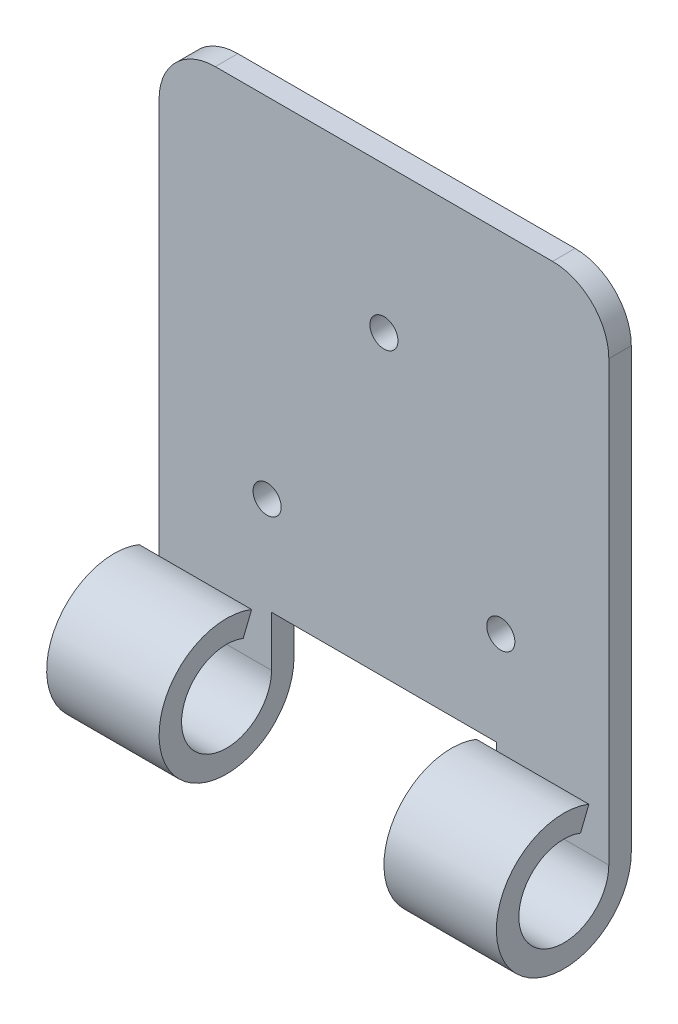
ISO-10303-21;
HEADER;
FILE_DESCRIPTION(('STEP AP214'),'2;1');
FILE_NAME('part.step','',(''),(''),'','','');
FILE_SCHEMA(('AUTOMOTIVE_DESIGN { 1 0 10303 214 1 1 1 1 }'));
ENDSEC;
DATA;
#1=APPLICATION_CONTEXT('core data for automotive mechanical design processes');
#2=APPLICATION_PROTOCOL_DEFINITION('international standard','automotive_design',2000,#1);
#3=PRODUCT_CONTEXT('',#1,'mechanical');
#4=PRODUCT('Part','Part','',(#3));
#5=PRODUCT_RELATED_PRODUCT_CATEGORY('part','',(#4));
#6=PRODUCT_DEFINITION_FORMATION('','',#4);
#7=PRODUCT_DEFINITION_CONTEXT('part definition',#1,'design');
#8=PRODUCT_DEFINITION('design','',#6,#7);
#9=PRODUCT_DEFINITION_SHAPE('','',#8);
#10=(LENGTH_UNIT() NAMED_UNIT(*) SI_UNIT(.MILLI.,.METRE.));
#11=(NAMED_UNIT(*) PLANE_ANGLE_UNIT() SI_UNIT($,.RADIAN.));
#12=(NAMED_UNIT(*) SI_UNIT($,.STERADIAN.) SOLID_ANGLE_UNIT());
#13=UNCERTAINTY_MEASURE_WITH_UNIT(LENGTH_MEASURE(1.E-05),#10,'distance_accuracy_value','');
#14=(GEOMETRIC_REPRESENTATION_CONTEXT(3) GLOBAL_UNCERTAINTY_ASSIGNED_CONTEXT((#13)) GLOBAL_UNIT_ASSIGNED_CONTEXT((#10,
#11,#12)) REPRESENTATION_CONTEXT('',''));
#15=CARTESIAN_POINT('',(0.,0.,0.));
#16=DIRECTION('',(0.,0.,1.));
#17=DIRECTION('',(1.,0.,0.));
#18=AXIS2_PLACEMENT_3D('',#15,#16,#17);
#19=CARTESIAN_POINT('',(0.,0.,2.));
#20=DIRECTION('',(1.,0.,0.));
#21=DIRECTION('',(0.,0.,-1.));
#22=AXIS2_PLACEMENT_3D('',#19,#20,#21);
#23=PLANE('',#22);
#24=DIRECTION('',(0.,-1.,0.));
#25=VECTOR('',#24,1.);
#26=CARTESIAN_POINT('',(0.,0.,0.));
#27=LINE('',#26,#25);
#28=CARTESIAN_POINT('',(0.,45.,0.));
#29=VERTEX_POINT('',#28);
#30=CARTESIAN_POINT('',(0.,6.,0.));
#31=VERTEX_POINT('',#30);
#32=EDGE_CURVE('E232',#29,#31,#27,.T.);
#33=ORIENTED_EDGE('',*,*,#32,.T.);
#34=CARTESIAN_POINT('',(0.,6.,6.));
#35=DIRECTION('',(-1.,0.,0.));
#36=DIRECTION('',(0.,0.,1.));
#37=AXIS2_PLACEMENT_3D('',#34,#35,#36);
#38=CIRCLE('',#37,6.);
#39=CARTESIAN_POINT('',(0.,11.5712381917052,3.77260129045439));
#40=VERTEX_POINT('',#39);
#41=EDGE_CURVE('E187',#31,#40,#38,.T.);
#42=ORIENTED_EDGE('',*,*,#41,.T.);
#43=DIRECTION('',(0.,-0.928539698617532,0.371233118257601));
#44=VECTOR('',#43,1.);
#45=CARTESIAN_POINT('',(0.,11.5712381917052,3.77260129045439));
#46=LINE('',#45,#44);
#47=CARTESIAN_POINT('',(0.,9.71415879447013,4.51506752696959));
#48=VERTEX_POINT('',#47);
#49=EDGE_CURVE('E199',#40,#48,#46,.T.);
#50=ORIENTED_EDGE('',*,*,#49,.T.);
#51=CARTESIAN_POINT('',(0.,6.,6.));
#52=DIRECTION('',(-1.,0.,0.));
#53=DIRECTION('',(0.,0.,1.));
#54=AXIS2_PLACEMENT_3D('',#51,#52,#53);
#55=CIRCLE('',#54,4.);
#56=CARTESIAN_POINT('',(0.,6.,2.));
#57=VERTEX_POINT('',#56);
#58=EDGE_CURVE('E191',#57,#48,#55,.T.);
#59=ORIENTED_EDGE('',*,*,#58,.F.);
#60=DIRECTION('',(0.,-1.,0.));
#61=VECTOR('',#60,1.);
#62=CARTESIAN_POINT('',(0.,0.,2.));
#63=LINE('',#62,#61);
#64=CARTESIAN_POINT('',(0.,45.,2.));
#65=VERTEX_POINT('',#64);
#66=EDGE_CURVE('E222',#65,#57,#63,.T.);
#67=ORIENTED_EDGE('',*,*,#66,.F.);
#68=DIRECTION('',(0.,0.,-1.));
#69=VECTOR('',#68,1.);
#70=CARTESIAN_POINT('',(0.,45.,2.));
#71=LINE('',#70,#69);
#72=EDGE_CURVE('E256',#65,#29,#71,.T.);
#73=ORIENTED_EDGE('',*,*,#72,.T.);
#74=EDGE_LOOP('',(#33,#42,#50,#59,#67,#73));
#75=FACE_BOUND('',#74,.T.);
#76=ADVANCED_FACE('F37',(#75),#23,.F.);
#77=CARTESIAN_POINT('',(40.,0.,2.));
#78=DIRECTION('',(-1.,0.,0.));
#79=DIRECTION('',(0.,0.,1.));
#80=AXIS2_PLACEMENT_3D('',#77,#78,#79);
#81=PLANE('',#80);
#82=DIRECTION('',(0.,1.,0.));
#83=VECTOR('',#82,1.);
#84=CARTESIAN_POINT('',(40.,0.,2.));
#85=LINE('',#84,#83);
#86=CARTESIAN_POINT('',(40.,6.,2.));
#87=VERTEX_POINT('',#86);
#88=CARTESIAN_POINT('',(40.,45.,2.));
#89=VERTEX_POINT('',#88);
#90=EDGE_CURVE('E225',#87,#89,#85,.T.);
#91=ORIENTED_EDGE('',*,*,#90,.F.);
#92=CARTESIAN_POINT('',(40.,6.,6.));
#93=DIRECTION('',(1.,0.,0.));
#94=DIRECTION('',(0.,0.,1.));
#95=AXIS2_PLACEMENT_3D('',#92,#93,#94);
#96=CIRCLE('',#95,4.);
#97=CARTESIAN_POINT('',(40.,9.71415879447013,4.51506752696959));
#98=VERTEX_POINT('',#97);
#99=EDGE_CURVE('E171',#98,#87,#96,.T.);
#100=ORIENTED_EDGE('',*,*,#99,.F.);
#101=DIRECTION('',(0.,-0.928539698617533,0.3712331182576));
#102=VECTOR('',#101,1.);
#103=CARTESIAN_POINT('',(40.,11.5712381917052,3.77260129045439));
#104=LINE('',#103,#102);
#105=CARTESIAN_POINT('',(40.,11.5712381917052,3.77260129045439));
#106=VERTEX_POINT('',#105);
#107=EDGE_CURVE('E176',#106,#98,#104,.T.);
#108=ORIENTED_EDGE('',*,*,#107,.F.);
#109=CARTESIAN_POINT('',(40.,6.,6.));
#110=DIRECTION('',(-1.,0.,0.));
#111=DIRECTION('',(0.,0.,1.));
#112=AXIS2_PLACEMENT_3D('',#109,#110,#111);
#113=CIRCLE('',#112,6.);
#114=CARTESIAN_POINT('',(40.,6.,0.));
#115=VERTEX_POINT('',#114);
#116=EDGE_CURVE('E167',#115,#106,#113,.T.);
#117=ORIENTED_EDGE('',*,*,#116,.F.);
#118=DIRECTION('',(0.,1.,0.));
#119=VECTOR('',#118,1.);
#120=CARTESIAN_POINT('',(40.,0.,0.));
#121=LINE('',#120,#119);
#122=CARTESIAN_POINT('',(40.,45.,0.));
#123=VERTEX_POINT('',#122);
#124=EDGE_CURVE('E235',#115,#123,#121,.T.);
#125=ORIENTED_EDGE('',*,*,#124,.T.);
#126=DIRECTION('',(0.,0.,-1.));
#127=VECTOR('',#126,1.);
#128=CARTESIAN_POINT('',(40.,45.,2.));
#129=LINE('',#128,#127);
#130=EDGE_CURVE('E249',#123,#89,#129,.F.);
#131=ORIENTED_EDGE('',*,*,#130,.T.);
#132=EDGE_LOOP('',(#91,#100,#108,#117,#125,#131));
#133=FACE_BOUND('',#132,.T.);
#134=ADVANCED_FACE('F297',(#133),#81,.F.);
#135=CARTESIAN_POINT('',(0.,0.,2.));
#136=DIRECTION('',(0.,0.,-1.));
#137=DIRECTION('',(-1.,0.,0.));
#138=AXIS2_PLACEMENT_3D('',#135,#136,#137);
#139=PLANE('',#138);
#140=CARTESIAN_POINT('',(20.,37.,2.));
#141=DIRECTION('',(0.,0.,1.));
#142=DIRECTION('',(1.,0.,0.));
#143=AXIS2_PLACEMENT_3D('',#140,#141,#142);
#144=CIRCLE('',#143,1.25);
#145=CARTESIAN_POINT('',(21.25,37.,2.));
#146=VERTEX_POINT('',#145);
#147=EDGE_CURVE('E212',#146,#146,#144,.T.);
#148=ORIENTED_EDGE('',*,*,#147,.F.);
#149=EDGE_LOOP('',(#148));
#150=FACE_BOUND('',#149,.T.);
#151=CARTESIAN_POINT('',(9.60769515458718,18.9999999999998,2.));
#152=DIRECTION('',(0.,0.,1.));
#153=DIRECTION('',(1.,0.,0.));
#154=AXIS2_PLACEMENT_3D('',#151,#152,#153);
#155=CIRCLE('',#154,1.25);
#156=CARTESIAN_POINT('',(10.8576951545872,18.9999999999998,2.));
#157=VERTEX_POINT('',#156);
#158=EDGE_CURVE('E217',#157,#157,#155,.T.);
#159=ORIENTED_EDGE('',*,*,#158,.F.);
#160=EDGE_LOOP('',(#159));
#161=FACE_BOUND('',#160,.T.);
#162=CARTESIAN_POINT('',(30.3923048454137,19.0000000000002,2.));
#163=DIRECTION('',(0.,0.,1.));
#164=DIRECTION('',(1.,0.,0.));
#165=AXIS2_PLACEMENT_3D('',#162,#163,#164);
#166=CIRCLE('',#165,1.25);
#167=CARTESIAN_POINT('',(31.6423048454137,19.0000000000002,2.));
#168=VERTEX_POINT('',#167);
#169=EDGE_CURVE('E213',#168,#168,#166,.T.);
#170=ORIENTED_EDGE('',*,*,#169,.F.);
#171=EDGE_LOOP('',(#170));
#172=FACE_BOUND('',#171,.T.);
#173=DIRECTION('',(-1.,0.,0.));
#174=VECTOR('',#173,1.);
#175=CARTESIAN_POINT('',(30.,10.4721359549996,2.));
#176=LINE('',#175,#174);
#177=CARTESIAN_POINT('',(30.,10.4721359549996,2.));
#178=VERTEX_POINT('',#177);
#179=CARTESIAN_POINT('',(10.,10.4721359549996,2.));
#180=VERTEX_POINT('',#179);
#181=EDGE_CURVE('E146',#178,#180,#176,.T.);
#182=ORIENTED_EDGE('',*,*,#181,.F.);
#183=DIRECTION('',(0.,-1.,0.));
#184=VECTOR('',#183,1.);
#185=CARTESIAN_POINT('',(30.,0.,2.));
#186=LINE('',#185,#184);
#187=CARTESIAN_POINT('',(30.,6.,2.));
#188=VERTEX_POINT('',#187);
#189=EDGE_CURVE('E152',#178,#188,#186,.T.);
#190=ORIENTED_EDGE('',*,*,#189,.T.);
#191=DIRECTION('',(1.,0.,0.));
#192=VECTOR('',#191,1.);
#193=CARTESIAN_POINT('',(30.,6.,2.));
#194=LINE('',#193,#192);
#195=EDGE_CURVE('E174',#188,#87,#194,.T.);
#196=ORIENTED_EDGE('',*,*,#195,.T.);
#197=ORIENTED_EDGE('',*,*,#90,.T.);
#198=CARTESIAN_POINT('',(35.,45.,2.));
#199=DIRECTION('',(0.,0.,-1.));
#200=DIRECTION('',(-1.,0.,0.));
#201=AXIS2_PLACEMENT_3D('',#198,#199,#200);
#202=CIRCLE('',#201,5.);
#203=CARTESIAN_POINT('',(35.,50.,2.));
#204=VERTEX_POINT('',#203);
#205=EDGE_CURVE('E254',#89,#204,#202,.F.);
#206=ORIENTED_EDGE('',*,*,#205,.T.);
#207=DIRECTION('',(-1.,0.,0.));
#208=VECTOR('',#207,1.);
#209=CARTESIAN_POINT('',(0.,50.,2.));
#210=LINE('',#209,#208);
#211=CARTESIAN_POINT('',(5.,50.,2.));
#212=VERTEX_POINT('',#211);
#213=EDGE_CURVE('E228',#204,#212,#210,.T.);
#214=ORIENTED_EDGE('',*,*,#213,.T.);
#215=CARTESIAN_POINT('',(5.,45.,2.));
#216=DIRECTION('',(0.,0.,-1.));
#217=DIRECTION('',(-1.,0.,0.));
#218=AXIS2_PLACEMENT_3D('',#215,#216,#217);
#219=CIRCLE('',#218,5.);
#220=EDGE_CURVE('E252',#212,#65,#219,.F.);
#221=ORIENTED_EDGE('',*,*,#220,.T.);
#222=ORIENTED_EDGE('',*,*,#66,.T.);
#223=DIRECTION('',(1.,0.,0.));
#224=VECTOR('',#223,1.);
#225=CARTESIAN_POINT('',(0.,6.,2.));
#226=LINE('',#225,#224);
#227=CARTESIAN_POINT('',(10.,6.,2.));
#228=VERTEX_POINT('',#227);
#229=EDGE_CURVE('E206',#57,#228,#226,.T.);
#230=ORIENTED_EDGE('',*,*,#229,.T.);
#231=DIRECTION('',(0.,-1.,0.));
#232=VECTOR('',#231,1.);
#233=CARTESIAN_POINT('',(10.,0.,2.));
#234=LINE('',#233,#232);
#235=EDGE_CURVE('E159',#180,#228,#234,.T.);
#236=ORIENTED_EDGE('',*,*,#235,.F.);
#237=EDGE_LOOP('',(#182,#190,#196,#197,#206,#214,#221,#222,#230,#236));
#238=FACE_BOUND('',#237,.T.);
#239=ADVANCED_FACE('F161',(#150,#161,#172,#238),#139,.F.);
#240=CARTESIAN_POINT('',(0.,0.,0.));
#241=DIRECTION('',(0.,0.,-1.));
#242=DIRECTION('',(-1.,0.,0.));
#243=AXIS2_PLACEMENT_3D('',#240,#241,#242);
#244=PLANE('',#243);
#245=CARTESIAN_POINT('',(30.3923048454137,19.0000000000002,0.));
#246=DIRECTION('',(0.,0.,-1.));
#247=DIRECTION('',(-1.,0.,0.));
#248=AXIS2_PLACEMENT_3D('',#245,#246,#247);
#249=CIRCLE('',#248,1.25);
#250=CARTESIAN_POINT('',(29.1423048454137,19.0000000000002,0.));
#251=VERTEX_POINT('',#250);
#252=EDGE_CURVE('E236',#251,#251,#249,.T.);
#253=ORIENTED_EDGE('',*,*,#252,.F.);
#254=EDGE_LOOP('',(#253));
#255=FACE_BOUND('',#254,.T.);
#256=CARTESIAN_POINT('',(9.60769515458718,18.9999999999998,0.));
#257=DIRECTION('',(0.,0.,-1.));
#258=DIRECTION('',(-1.,0.,0.));
#259=AXIS2_PLACEMENT_3D('',#256,#257,#258);
#260=CIRCLE('',#259,1.25);
#261=CARTESIAN_POINT('',(8.35769515458718,18.9999999999998,0.));
#262=VERTEX_POINT('',#261);
#263=EDGE_CURVE('E262',#262,#262,#260,.T.);
#264=ORIENTED_EDGE('',*,*,#263,.F.);
#265=EDGE_LOOP('',(#264));
#266=FACE_BOUND('',#265,.T.);
#267=CARTESIAN_POINT('',(20.,37.,0.));
#268=DIRECTION('',(0.,0.,-1.));
#269=DIRECTION('',(-1.,0.,0.));
#270=AXIS2_PLACEMENT_3D('',#267,#268,#269);
#271=CIRCLE('',#270,1.25);
#272=CARTESIAN_POINT('',(18.75,37.,0.));
#273=VERTEX_POINT('',#272);
#274=EDGE_CURVE('E216',#273,#273,#271,.T.);
#275=ORIENTED_EDGE('',*,*,#274,.F.);
#276=EDGE_LOOP('',(#275));
#277=FACE_BOUND('',#276,.T.);
#278=DIRECTION('',(-1.,0.,0.));
#279=VECTOR('',#278,1.);
#280=CARTESIAN_POINT('',(0.,11.1380930314661,0.));
#281=LINE('',#280,#279);
#282=CARTESIAN_POINT('',(30.,11.1380930314661,0.));
#283=VERTEX_POINT('',#282);
#284=CARTESIAN_POINT('',(10.,11.1380930314661,0.));
#285=VERTEX_POINT('',#284);
#286=EDGE_CURVE('E269',#283,#285,#281,.T.);
#287=ORIENTED_EDGE('',*,*,#286,.T.);
#288=DIRECTION('',(0.,-1.,0.));
#289=VECTOR('',#288,1.);
#290=CARTESIAN_POINT('',(10.,6.,0.));
#291=LINE('',#290,#289);
#292=CARTESIAN_POINT('',(10.,6.,0.));
#293=VERTEX_POINT('',#292);
#294=EDGE_CURVE('E272',#285,#293,#291,.T.);
#295=ORIENTED_EDGE('',*,*,#294,.T.);
#296=DIRECTION('',(-1.,0.,0.));
#297=VECTOR('',#296,1.);
#298=CARTESIAN_POINT('',(10.,6.,0.));
#299=LINE('',#298,#297);
#300=EDGE_CURVE('E203',#293,#31,#299,.T.);
#301=ORIENTED_EDGE('',*,*,#300,.T.);
#302=ORIENTED_EDGE('',*,*,#32,.F.);
#303=CARTESIAN_POINT('',(5.,45.,0.));
#304=DIRECTION('',(0.,0.,-1.));
#305=DIRECTION('',(-1.,0.,0.));
#306=AXIS2_PLACEMENT_3D('',#303,#304,#305);
#307=CIRCLE('',#306,5.);
#308=CARTESIAN_POINT('',(5.,50.,0.));
#309=VERTEX_POINT('',#308);
#310=EDGE_CURVE('E244',#29,#309,#307,.T.);
#311=ORIENTED_EDGE('',*,*,#310,.T.);
#312=DIRECTION('',(-1.,0.,0.));
#313=VECTOR('',#312,1.);
#314=CARTESIAN_POINT('',(0.,50.,0.));
#315=LINE('',#314,#313);
#316=CARTESIAN_POINT('',(35.,50.,0.));
#317=VERTEX_POINT('',#316);
#318=EDGE_CURVE('E226',#317,#309,#315,.T.);
#319=ORIENTED_EDGE('',*,*,#318,.F.);
#320=CARTESIAN_POINT('',(35.,45.,0.));
#321=DIRECTION('',(0.,0.,-1.));
#322=DIRECTION('',(-1.,0.,0.));
#323=AXIS2_PLACEMENT_3D('',#320,#321,#322);
#324=CIRCLE('',#323,5.);
#325=EDGE_CURVE('E246',#317,#123,#324,.T.);
#326=ORIENTED_EDGE('',*,*,#325,.T.);
#327=ORIENTED_EDGE('',*,*,#124,.F.);
#328=DIRECTION('',(-1.,0.,0.));
#329=VECTOR('',#328,1.);
#330=CARTESIAN_POINT('',(0.,6.,0.));
#331=LINE('',#330,#329);
#332=CARTESIAN_POINT('',(30.,6.,0.));
#333=VERTEX_POINT('',#332);
#334=EDGE_CURVE('E259',#115,#333,#331,.T.);
#335=ORIENTED_EDGE('',*,*,#334,.T.);
#336=DIRECTION('',(0.,1.,0.));
#337=VECTOR('',#336,1.);
#338=CARTESIAN_POINT('',(30.,0.,0.));
#339=LINE('',#338,#337);
#340=EDGE_CURVE('E51',#333,#283,#339,.T.);
#341=ORIENTED_EDGE('',*,*,#340,.T.);
#342=EDGE_LOOP('',(#287,#295,#301,#302,#311,#319,#326,#327,#335,#341));
#343=FACE_BOUND('',#342,.T.);
#344=ADVANCED_FACE('F281',(#255,#266,#277,#343),#244,.T.);
#345=CARTESIAN_POINT('',(0.,50.,2.));
#346=DIRECTION('',(0.,-1.,0.));
#347=DIRECTION('',(0.,0.,-1.));
#348=AXIS2_PLACEMENT_3D('',#345,#346,#347);
#349=PLANE('',#348);
#350=ORIENTED_EDGE('',*,*,#213,.F.);
#351=DIRECTION('',(0.,0.,-1.));
#352=VECTOR('',#351,1.);
#353=CARTESIAN_POINT('',(35.,50.,2.));
#354=LINE('',#353,#352);
#355=EDGE_CURVE('E241',#204,#317,#354,.T.);
#356=ORIENTED_EDGE('',*,*,#355,.T.);
#357=ORIENTED_EDGE('',*,*,#318,.T.);
#358=DIRECTION('',(0.,0.,-1.));
#359=VECTOR('',#358,1.);
#360=CARTESIAN_POINT('',(5.,50.,2.));
#361=LINE('',#360,#359);
#362=EDGE_CURVE('E231',#309,#212,#361,.F.);
#363=ORIENTED_EDGE('',*,*,#362,.T.);
#364=EDGE_LOOP('',(#350,#356,#357,#363));
#365=FACE_BOUND('',#364,.T.);
#366=ADVANCED_FACE('F306',(#365),#349,.F.);
#367=CARTESIAN_POINT('',(35.,45.,2.));
#368=DIRECTION('',(0.,0.,-1.));
#369=DIRECTION('',(-1.,0.,0.));
#370=AXIS2_PLACEMENT_3D('',#367,#368,#369);
#371=CYLINDRICAL_SURFACE('',#370,5.);
#372=ORIENTED_EDGE('',*,*,#205,.F.);
#373=ORIENTED_EDGE('',*,*,#130,.F.);
#374=ORIENTED_EDGE('',*,*,#325,.F.);
#375=ORIENTED_EDGE('',*,*,#355,.F.);
#376=EDGE_LOOP('',(#372,#373,#374,#375));
#377=FACE_BOUND('',#376,.T.);
#378=ADVANCED_FACE('F302',(#377),#371,.T.);
#379=CARTESIAN_POINT('',(5.,45.,2.));
#380=DIRECTION('',(0.,0.,-1.));
#381=DIRECTION('',(-1.,0.,0.));
#382=AXIS2_PLACEMENT_3D('',#379,#380,#381);
#383=CYLINDRICAL_SURFACE('',#382,5.);
#384=ORIENTED_EDGE('',*,*,#220,.F.);
#385=ORIENTED_EDGE('',*,*,#362,.F.);
#386=ORIENTED_EDGE('',*,*,#310,.F.);
#387=ORIENTED_EDGE('',*,*,#72,.F.);
#388=EDGE_LOOP('',(#384,#385,#386,#387));
#389=FACE_BOUND('',#388,.T.);
#390=ADVANCED_FACE('F310',(#389),#383,.T.);
#391=CARTESIAN_POINT('',(20.,37.,-1.));
#392=DIRECTION('',(0.,0.,1.));
#393=DIRECTION('',(1.,0.,0.));
#394=AXIS2_PLACEMENT_3D('',#391,#392,#393);
#395=CYLINDRICAL_SURFACE('',#394,1.25);
#396=ORIENTED_EDGE('',*,*,#274,.T.);
#397=EDGE_LOOP('',(#396));
#398=FACE_BOUND('',#397,.T.);
#399=ORIENTED_EDGE('',*,*,#147,.T.);
#400=EDGE_LOOP('',(#399));
#401=FACE_BOUND('',#400,.T.);
#402=ADVANCED_FACE('F347',(#398,#401),#395,.F.);
#403=CARTESIAN_POINT('',(9.60769515458718,18.9999999999998,-1.));
#404=DIRECTION('',(0.,0.,1.));
#405=DIRECTION('',(1.,0.,0.));
#406=AXIS2_PLACEMENT_3D('',#403,#404,#405);
#407=CYLINDRICAL_SURFACE('',#406,1.25);
#408=ORIENTED_EDGE('',*,*,#263,.T.);
#409=EDGE_LOOP('',(#408));
#410=FACE_BOUND('',#409,.T.);
#411=ORIENTED_EDGE('',*,*,#158,.T.);
#412=EDGE_LOOP('',(#411));
#413=FACE_BOUND('',#412,.T.);
#414=ADVANCED_FACE('F351',(#410,#413),#407,.F.);
#415=CARTESIAN_POINT('',(30.3923048454137,19.0000000000002,-1.));
#416=DIRECTION('',(0.,0.,1.));
#417=DIRECTION('',(1.,0.,0.));
#418=AXIS2_PLACEMENT_3D('',#415,#416,#417);
#419=CYLINDRICAL_SURFACE('',#418,1.25);
#420=ORIENTED_EDGE('',*,*,#252,.T.);
#421=EDGE_LOOP('',(#420));
#422=FACE_BOUND('',#421,.T.);
#423=ORIENTED_EDGE('',*,*,#169,.T.);
#424=EDGE_LOOP('',(#423));
#425=FACE_BOUND('',#424,.T.);
#426=ADVANCED_FACE('F357',(#422,#425),#419,.F.);
#427=CARTESIAN_POINT('',(10.,6.,6.));
#428=DIRECTION('',(-1.,0.,0.));
#429=DIRECTION('',(0.,0.,1.));
#430=AXIS2_PLACEMENT_3D('',#427,#428,#429);
#431=CYLINDRICAL_SURFACE('',#430,4.);
#432=ORIENTED_EDGE('',*,*,#58,.T.);
#433=DIRECTION('',(-1.,0.,0.));
#434=VECTOR('',#433,1.);
#435=CARTESIAN_POINT('',(10.,9.71415879447013,4.51506752696959));
#436=LINE('',#435,#434);
#437=CARTESIAN_POINT('',(10.,9.71415879447013,4.51506752696959));
#438=VERTEX_POINT('',#437);
#439=EDGE_CURVE('E207',#438,#48,#436,.T.);
#440=ORIENTED_EDGE('',*,*,#439,.F.);
#441=CARTESIAN_POINT('',(10.,6.,6.));
#442=DIRECTION('',(-1.,0.,0.));
#443=DIRECTION('',(0.,0.,1.));
#444=AXIS2_PLACEMENT_3D('',#441,#442,#443);
#445=CIRCLE('',#444,4.);
#446=EDGE_CURVE('E194',#228,#438,#445,.T.);
#447=ORIENTED_EDGE('',*,*,#446,.F.);
#448=ORIENTED_EDGE('',*,*,#229,.F.);
#449=EDGE_LOOP('',(#432,#440,#447,#448));
#450=FACE_BOUND('',#449,.T.);
#451=ADVANCED_FACE('F320',(#450),#431,.F.);
#452=CARTESIAN_POINT('',(10.,11.5712381917052,3.77260129045439));
#453=DIRECTION('',(0.,-0.371233118257601,-0.928539698617532));
#454=DIRECTION('',(0.,0.928539698617532,-0.371233118257601));
#455=AXIS2_PLACEMENT_3D('',#452,#453,#454);
#456=PLANE('',#455);
#457=ORIENTED_EDGE('',*,*,#49,.F.);
#458=DIRECTION('',(-1.,0.,0.));
#459=VECTOR('',#458,1.);
#460=CARTESIAN_POINT('',(10.,11.5712381917052,3.77260129045439));
#461=LINE('',#460,#459);
#462=CARTESIAN_POINT('',(10.,11.5712381917052,3.77260129045439));
#463=VERTEX_POINT('',#462);
#464=EDGE_CURVE('E196',#463,#40,#461,.T.);
#465=ORIENTED_EDGE('',*,*,#464,.F.);
#466=DIRECTION('',(0.,-0.928539698617532,0.371233118257601));
#467=VECTOR('',#466,1.);
#468=CARTESIAN_POINT('',(10.,11.5712381917052,3.77260129045439));
#469=LINE('',#468,#467);
#470=EDGE_CURVE('E190',#463,#438,#469,.T.);
#471=ORIENTED_EDGE('',*,*,#470,.T.);
#472=ORIENTED_EDGE('',*,*,#439,.T.);
#473=EDGE_LOOP('',(#457,#465,#471,#472));
#474=FACE_BOUND('',#473,.T.);
#475=ADVANCED_FACE('F324',(#474),#456,.T.);
#476=CARTESIAN_POINT('',(10.,6.,6.));
#477=DIRECTION('',(-1.,0.,0.));
#478=DIRECTION('',(0.,0.,1.));
#479=AXIS2_PLACEMENT_3D('',#476,#477,#478);
#480=CYLINDRICAL_SURFACE('',#479,6.);
#481=ORIENTED_EDGE('',*,*,#41,.F.);
#482=ORIENTED_EDGE('',*,*,#300,.F.);
#483=CARTESIAN_POINT('',(10.,6.,6.));
#484=DIRECTION('',(-1.,0.,0.));
#485=DIRECTION('',(0.,0.,1.));
#486=AXIS2_PLACEMENT_3D('',#483,#484,#485);
#487=CIRCLE('',#486,6.);
#488=EDGE_CURVE('E188',#293,#463,#487,.T.);
#489=ORIENTED_EDGE('',*,*,#488,.T.);
#490=ORIENTED_EDGE('',*,*,#464,.T.);
#491=EDGE_LOOP('',(#481,#482,#489,#490));
#492=FACE_BOUND('',#491,.T.);
#493=ADVANCED_FACE('F326',(#492),#480,.T.);
#494=CARTESIAN_POINT('',(10.,6.,6.));
#495=DIRECTION('',(-1.,0.,0.));
#496=DIRECTION('',(0.,0.,1.));
#497=AXIS2_PLACEMENT_3D('',#494,#495,#496);
#498=PLANE('',#497);
#499=ORIENTED_EDGE('',*,*,#488,.F.);
#500=ORIENTED_EDGE('',*,*,#294,.F.);
#501=CARTESIAN_POINT('',(10.,11.1380930314661,1.1));
#502=DIRECTION('',(-1.,0.,0.));
#503=DIRECTION('',(0.,0.,1.));
#504=AXIS2_PLACEMENT_3D('',#501,#502,#503);
#505=CIRCLE('',#504,1.1);
#506=CARTESIAN_POINT('',(10.,10.3420504491262,1.85915492957747));
#507=VERTEX_POINT('',#506);
#508=EDGE_CURVE('E45',#285,#507,#505,.T.);
#509=ORIENTED_EDGE('',*,*,#508,.T.);
#510=CARTESIAN_POINT('',(10.,6.,6.));
#511=DIRECTION('',(1.,0.,0.));
#512=DIRECTION('',(0.,0.,-1.));
#513=AXIS2_PLACEMENT_3D('',#510,#511,#512);
#514=CIRCLE('',#513,6.);
#515=EDGE_CURVE('E149',#507,#180,#514,.T.);
#516=ORIENTED_EDGE('',*,*,#515,.T.);
#517=ORIENTED_EDGE('',*,*,#235,.T.);
#518=ORIENTED_EDGE('',*,*,#446,.T.);
#519=ORIENTED_EDGE('',*,*,#470,.F.);
#520=EDGE_LOOP('',(#499,#500,#509,#516,#517,#518,#519));
#521=FACE_BOUND('',#520,.T.);
#522=ADVANCED_FACE('F277',(#521),#498,.F.);
#523=CARTESIAN_POINT('',(30.,6.,6.));
#524=DIRECTION('',(1.,0.,0.));
#525=DIRECTION('',(0.,0.,-1.));
#526=AXIS2_PLACEMENT_3D('',#523,#524,#525);
#527=CYLINDRICAL_SURFACE('',#526,6.);
#528=ORIENTED_EDGE('',*,*,#116,.T.);
#529=DIRECTION('',(1.,0.,0.));
#530=VECTOR('',#529,1.);
#531=CARTESIAN_POINT('',(30.,11.5712381917052,3.77260129045439));
#532=LINE('',#531,#530);
#533=CARTESIAN_POINT('',(30.,11.5712381917052,3.77260129045439));
#534=VERTEX_POINT('',#533);
#535=EDGE_CURVE('E184',#534,#106,#532,.T.);
#536=ORIENTED_EDGE('',*,*,#535,.F.);
#537=CARTESIAN_POINT('',(30.,6.,6.));
#538=DIRECTION('',(-1.,0.,0.));
#539=DIRECTION('',(0.,0.,1.));
#540=AXIS2_PLACEMENT_3D('',#537,#538,#539);
#541=CIRCLE('',#540,6.);
#542=EDGE_CURVE('E168',#333,#534,#541,.T.);
#543=ORIENTED_EDGE('',*,*,#542,.F.);
#544=ORIENTED_EDGE('',*,*,#334,.F.);
#545=EDGE_LOOP('',(#528,#536,#543,#544));
#546=FACE_BOUND('',#545,.T.);
#547=ADVANCED_FACE('F287',(#546),#527,.T.);
#548=CARTESIAN_POINT('',(30.,11.5712381917052,3.77260129045439));
#549=DIRECTION('',(0.,0.3712331182576,0.928539698617533));
#550=DIRECTION('',(0.,-0.928539698617533,0.3712331182576));
#551=AXIS2_PLACEMENT_3D('',#548,#549,#550);
#552=PLANE('',#551);
#553=ORIENTED_EDGE('',*,*,#107,.T.);
#554=DIRECTION('',(1.,0.,0.));
#555=VECTOR('',#554,1.);
#556=CARTESIAN_POINT('',(30.,9.71415879447013,4.51506752696959));
#557=LINE('',#556,#555);
#558=CARTESIAN_POINT('',(30.,9.71415879447013,4.51506752696959));
#559=VERTEX_POINT('',#558);
#560=EDGE_CURVE('E181',#559,#98,#557,.T.);
#561=ORIENTED_EDGE('',*,*,#560,.F.);
#562=DIRECTION('',(0.,-0.928539698617533,0.3712331182576));
#563=VECTOR('',#562,1.);
#564=CARTESIAN_POINT('',(30.,11.5712381917052,3.77260129045439));
#565=LINE('',#564,#563);
#566=EDGE_CURVE('E170',#534,#559,#565,.T.);
#567=ORIENTED_EDGE('',*,*,#566,.F.);
#568=ORIENTED_EDGE('',*,*,#535,.T.);
#569=EDGE_LOOP('',(#553,#561,#567,#568));
#570=FACE_BOUND('',#569,.T.);
#571=ADVANCED_FACE('F291',(#570),#552,.F.);
#572=CARTESIAN_POINT('',(30.,6.,6.));
#573=DIRECTION('',(1.,0.,0.));
#574=DIRECTION('',(0.,0.,-1.));
#575=AXIS2_PLACEMENT_3D('',#572,#573,#574);
#576=CYLINDRICAL_SURFACE('',#575,4.);
#577=ORIENTED_EDGE('',*,*,#99,.T.);
#578=ORIENTED_EDGE('',*,*,#195,.F.);
#579=CARTESIAN_POINT('',(30.,6.,6.));
#580=DIRECTION('',(1.,0.,0.));
#581=DIRECTION('',(0.,0.,1.));
#582=AXIS2_PLACEMENT_3D('',#579,#580,#581);
#583=CIRCLE('',#582,4.);
#584=EDGE_CURVE('E155',#559,#188,#583,.T.);
#585=ORIENTED_EDGE('',*,*,#584,.F.);
#586=ORIENTED_EDGE('',*,*,#560,.T.);
#587=EDGE_LOOP('',(#577,#578,#585,#586));
#588=FACE_BOUND('',#587,.T.);
#589=ADVANCED_FACE('F294',(#588),#576,.F.);
#590=CARTESIAN_POINT('',(30.,6.,6.));
#591=DIRECTION('',(-1.,0.,0.));
#592=DIRECTION('',(0.,0.,1.));
#593=AXIS2_PLACEMENT_3D('',#590,#591,#592);
#594=PLANE('',#593);
#595=ORIENTED_EDGE('',*,*,#542,.T.);
#596=ORIENTED_EDGE('',*,*,#566,.T.);
#597=ORIENTED_EDGE('',*,*,#584,.T.);
#598=ORIENTED_EDGE('',*,*,#189,.F.);
#599=CARTESIAN_POINT('',(30.,6.,6.));
#600=DIRECTION('',(1.,0.,0.));
#601=DIRECTION('',(0.,0.,-1.));
#602=AXIS2_PLACEMENT_3D('',#599,#600,#601);
#603=CIRCLE('',#602,6.);
#604=CARTESIAN_POINT('',(30.,10.3420504491262,1.85915492957747));
#605=VERTEX_POINT('',#604);
#606=EDGE_CURVE('E142',#605,#178,#603,.T.);
#607=ORIENTED_EDGE('',*,*,#606,.F.);
#608=CARTESIAN_POINT('',(30.,11.1380930314661,1.1));
#609=DIRECTION('',(-1.,0.,0.));
#610=DIRECTION('',(0.,0.,1.));
#611=AXIS2_PLACEMENT_3D('',#608,#609,#610);
#612=CIRCLE('',#611,1.1);
#613=EDGE_CURVE('E11',#605,#283,#612,.F.);
#614=ORIENTED_EDGE('',*,*,#613,.T.);
#615=ORIENTED_EDGE('',*,*,#340,.F.);
#616=EDGE_LOOP('',(#595,#596,#597,#598,#607,#614,#615));
#617=FACE_BOUND('',#616,.T.);
#618=ADVANCED_FACE('F153',(#617),#594,.T.);
#619=CARTESIAN_POINT('',(30.,6.,6.));
#620=DIRECTION('',(-1.,0.,0.));
#621=DIRECTION('',(0.,0.,1.));
#622=AXIS2_PLACEMENT_3D('',#619,#620,#621);
#623=CYLINDRICAL_SURFACE('',#622,6.);
#624=ORIENTED_EDGE('',*,*,#515,.F.);
#625=DIRECTION('',(-1.,0.,0.));
#626=VECTOR('',#625,1.);
#627=CARTESIAN_POINT('',(30.,10.3420504491262,1.85915492957747));
#628=LINE('',#627,#626);
#629=EDGE_CURVE('E59',#507,#605,#628,.F.);
#630=ORIENTED_EDGE('',*,*,#629,.T.);
#631=ORIENTED_EDGE('',*,*,#606,.T.);
#632=ORIENTED_EDGE('',*,*,#181,.T.);
#633=EDGE_LOOP('',(#624,#630,#631,#632));
#634=FACE_BOUND('',#633,.T.);
#635=ADVANCED_FACE('F144',(#634),#623,.F.);
#636=CARTESIAN_POINT('',(30.,11.1380930314661,1.1));
#637=DIRECTION('',(-1.,0.,0.));
#638=DIRECTION('',(0.,0.,1.));
#639=AXIS2_PLACEMENT_3D('',#636,#637,#638);
#640=CYLINDRICAL_SURFACE('',#639,1.1);
#641=ORIENTED_EDGE('',*,*,#613,.F.);
#642=ORIENTED_EDGE('',*,*,#629,.F.);
#643=ORIENTED_EDGE('',*,*,#508,.F.);
#644=ORIENTED_EDGE('',*,*,#286,.F.);
#645=EDGE_LOOP('',(#641,#642,#643,#644));
#646=FACE_BOUND('',#645,.T.);
#647=ADVANCED_FACE('F39',(#646),#640,.T.);
#648=CLOSED_SHELL('',(#76,#134,#239,#344,#366,#378,#390,#402,#414,#426,#451,#475,#493,#522,#547,
#571,#589,#618,#635,#647));
#649=MANIFOLD_SOLID_BREP('B2',#648);
#650=ADVANCED_BREP_SHAPE_REPRESENTATION('',(#18,#649),#14);
#651=SHAPE_DEFINITION_REPRESENTATION(#9,#650);
ENDSEC;
END-ISO-10303-21;
